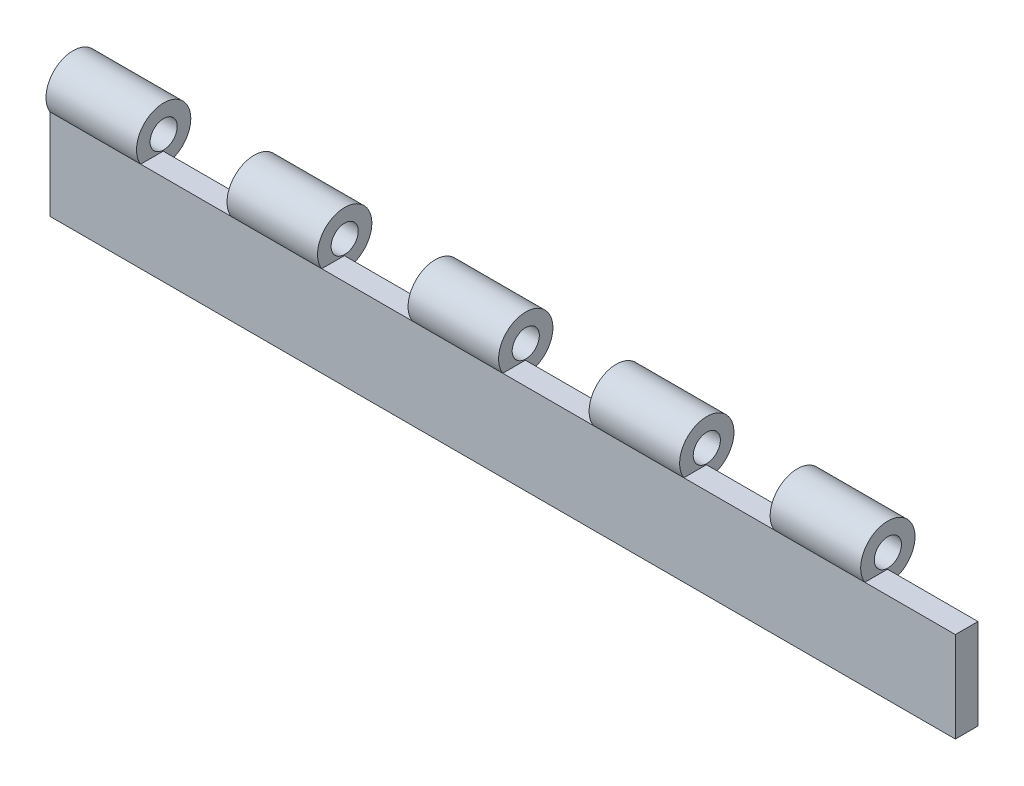
ISO-10303-21;
HEADER;
FILE_DESCRIPTION(('STEP AP214'),'2;1');
FILE_NAME('part.step','',(''),(''),'','','');
FILE_SCHEMA(('AUTOMOTIVE_DESIGN { 1 0 10303 214 1 1 1 1 }'));
ENDSEC;
DATA;
#1=APPLICATION_CONTEXT('core data for automotive mechanical design processes');
#2=APPLICATION_PROTOCOL_DEFINITION('international standard','automotive_design',2000,#1);
#3=PRODUCT_CONTEXT('',#1,'mechanical');
#4=PRODUCT('Part','Part','',(#3));
#5=PRODUCT_RELATED_PRODUCT_CATEGORY('part','',(#4));
#6=PRODUCT_DEFINITION_FORMATION('','',#4);
#7=PRODUCT_DEFINITION_CONTEXT('part definition',#1,'design');
#8=PRODUCT_DEFINITION('design','',#6,#7);
#9=PRODUCT_DEFINITION_SHAPE('','',#8);
#10=(LENGTH_UNIT() NAMED_UNIT(*) SI_UNIT(.MILLI.,.METRE.));
#11=(NAMED_UNIT(*) PLANE_ANGLE_UNIT() SI_UNIT($,.RADIAN.));
#12=(NAMED_UNIT(*) SI_UNIT($,.STERADIAN.) SOLID_ANGLE_UNIT());
#13=UNCERTAINTY_MEASURE_WITH_UNIT(LENGTH_MEASURE(1.E-05),#10,'distance_accuracy_value','');
#14=(GEOMETRIC_REPRESENTATION_CONTEXT(3) GLOBAL_UNCERTAINTY_ASSIGNED_CONTEXT((#13)) GLOBAL_UNIT_ASSIGNED_CONTEXT((#10,
#11,#12)) REPRESENTATION_CONTEXT('',''));
#15=CARTESIAN_POINT('',(0.,0.,0.));
#16=DIRECTION('',(0.,0.,1.));
#17=DIRECTION('',(1.,0.,0.));
#18=AXIS2_PLACEMENT_3D('',#15,#16,#17);
#19=CARTESIAN_POINT('',(12.3537042946623,24.6065364594952,2.75891847525368));
#20=DIRECTION('',(0.,-1.,0.));
#21=DIRECTION('',(0.,0.,-1.));
#22=AXIS2_PLACEMENT_3D('',#19,#20,#21);
#23=PLANE('',#22);
#24=DIRECTION('',(0.,0.,-1.));
#25=VECTOR('',#24,1.);
#26=CARTESIAN_POINT('',(218.093704294662,24.6065364594952,2.75891847525368));
#27=LINE('',#26,#25);
#28=CARTESIAN_POINT('',(218.093704294662,24.6065364594952,2.75891847525368));
#29=VERTEX_POINT('',#28);
#30=CARTESIAN_POINT('',(218.093704294662,24.6065364594952,-2.95608152474632));
#31=VERTEX_POINT('',#30);
#32=EDGE_CURVE('E165',#29,#31,#27,.T.);
#33=ORIENTED_EDGE('',*,*,#32,.F.);
#34=DIRECTION('',(-1.,0.,0.));
#35=VECTOR('',#34,1.);
#36=CARTESIAN_POINT('',(12.3537042946623,24.6065364594952,2.75891847525368));
#37=LINE('',#36,#35);
#38=CARTESIAN_POINT('',(240.953704294662,24.6065364594952,2.75891847525368));
#39=VERTEX_POINT('',#38);
#40=EDGE_CURVE('E280',#39,#29,#37,.T.);
#41=ORIENTED_EDGE('',*,*,#40,.F.);
#42=DIRECTION('',(0.,0.,-1.));
#43=VECTOR('',#42,1.);
#44=CARTESIAN_POINT('',(240.953704294662,24.6065364594952,2.75891847525368));
#45=LINE('',#44,#43);
#46=CARTESIAN_POINT('',(240.953704294662,24.6065364594952,-2.95608152474632));
#47=VERTEX_POINT('',#46);
#48=EDGE_CURVE('E283',#39,#47,#45,.T.);
#49=ORIENTED_EDGE('',*,*,#48,.T.);
#50=DIRECTION('',(-1.,0.,0.));
#51=VECTOR('',#50,1.);
#52=CARTESIAN_POINT('',(12.3537042946623,24.6065364594952,-2.95608152474632));
#53=LINE('',#52,#51);
#54=EDGE_CURVE('E275',#47,#31,#53,.T.);
#55=ORIENTED_EDGE('',*,*,#54,.T.);
#56=EDGE_LOOP('',(#33,#41,#49,#55));
#57=FACE_BOUND('',#56,.T.);
#58=ADVANCED_FACE('F35',(#57),#23,.F.);
#59=CARTESIAN_POINT('',(12.3537042946622,1.74653645949524,-2.95608152474632));
#60=DIRECTION('',(0.,0.,-1.));
#61=DIRECTION('',(-1.,0.,0.));
#62=AXIS2_PLACEMENT_3D('',#59,#60,#61);
#63=PLANE('',#62);
#64=DIRECTION('',(-1.,0.,0.));
#65=VECTOR('',#64,1.);
#66=CARTESIAN_POINT('',(218.093704294662,21.3974184715143,-2.95608152474632));
#67=LINE('',#66,#65);
#68=CARTESIAN_POINT('',(218.093704294662,21.3974184715143,-2.95608152474632));
#69=VERTEX_POINT('',#68);
#70=CARTESIAN_POINT('',(195.233704294662,21.3974184715143,-2.95608152474632));
#71=VERTEX_POINT('',#70);
#72=EDGE_CURVE('E157',#69,#71,#67,.T.);
#73=ORIENTED_EDGE('',*,*,#72,.F.);
#74=DIRECTION('',(0.,1.,0.));
#75=VECTOR('',#74,1.);
#76=CARTESIAN_POINT('',(218.093704294662,1.74653645949533,-2.95608152474632));
#77=LINE('',#76,#75);
#78=EDGE_CURVE('E180',#69,#31,#77,.T.);
#79=ORIENTED_EDGE('',*,*,#78,.T.);
#80=ORIENTED_EDGE('',*,*,#54,.F.);
#81=DIRECTION('',(0.,1.,0.));
#82=VECTOR('',#81,1.);
#83=CARTESIAN_POINT('',(240.953704294662,1.74653645949524,-2.95608152474632));
#84=LINE('',#83,#82);
#85=CARTESIAN_POINT('',(240.953704294662,1.74653645949524,-2.95608152474632));
#86=VERTEX_POINT('',#85);
#87=EDGE_CURVE('E289',#86,#47,#84,.T.);
#88=ORIENTED_EDGE('',*,*,#87,.F.);
#89=DIRECTION('',(1.,0.,0.));
#90=VECTOR('',#89,1.);
#91=CARTESIAN_POINT('',(12.3537042946622,1.74653645949524,-2.95608152474632));
#92=LINE('',#91,#90);
#93=CARTESIAN_POINT('',(12.3537042946622,1.74653645949524,-2.95608152474632));
#94=VERTEX_POINT('',#93);
#95=EDGE_CURVE('E287',#94,#86,#92,.T.);
#96=ORIENTED_EDGE('',*,*,#95,.F.);
#97=DIRECTION('',(0.,-1.,0.));
#98=VECTOR('',#97,1.);
#99=CARTESIAN_POINT('',(12.3537042946622,1.74653645949524,-2.95608152474632));
#100=LINE('',#99,#98);
#101=CARTESIAN_POINT('',(12.3537042946622,21.3974184715143,-2.95608152474632));
#102=VERTEX_POINT('',#101);
#103=EDGE_CURVE('E270',#102,#94,#100,.T.);
#104=ORIENTED_EDGE('',*,*,#103,.F.);
#105=DIRECTION('',(-1.,0.,0.));
#106=VECTOR('',#105,1.);
#107=CARTESIAN_POINT('',(35.2137042946623,21.3974184715143,-2.95608152474632));
#108=LINE('',#107,#106);
#109=CARTESIAN_POINT('',(35.2137042946623,21.3974184715143,-2.95608152474632));
#110=VERTEX_POINT('',#109);
#111=EDGE_CURVE('E305',#110,#102,#108,.T.);
#112=ORIENTED_EDGE('',*,*,#111,.F.);
#113=DIRECTION('',(0.,1.,0.));
#114=VECTOR('',#113,1.);
#115=CARTESIAN_POINT('',(35.2137042946623,1.74653645949525,-2.95608152474632));
#116=LINE('',#115,#114);
#117=CARTESIAN_POINT('',(35.2137042946623,24.6065364594952,-2.95608152474632));
#118=VERTEX_POINT('',#117);
#119=EDGE_CURVE('E302',#110,#118,#116,.T.);
#120=ORIENTED_EDGE('',*,*,#119,.T.);
#121=CARTESIAN_POINT('',(58.0737042946622,24.6065364594952,-2.95608152474632));
#122=VERTEX_POINT('',#121);
#123=EDGE_CURVE('E291',#122,#118,#53,.T.);
#124=ORIENTED_EDGE('',*,*,#123,.F.);
#125=DIRECTION('',(0.,1.,0.));
#126=VECTOR('',#125,1.);
#127=CARTESIAN_POINT('',(58.0737042946622,1.74653645949526,-2.95608152474632));
#128=LINE('',#127,#126);
#129=CARTESIAN_POINT('',(58.0737042946622,21.3974184715143,-2.95608152474632));
#130=VERTEX_POINT('',#129);
#131=EDGE_CURVE('E308',#130,#122,#128,.T.);
#132=ORIENTED_EDGE('',*,*,#131,.F.);
#133=DIRECTION('',(-1.,0.,0.));
#134=VECTOR('',#133,1.);
#135=CARTESIAN_POINT('',(80.9337042946622,21.3974184715143,-2.95608152474632));
#136=LINE('',#135,#134);
#137=CARTESIAN_POINT('',(80.9337042946622,21.3974184715143,-2.95608152474632));
#138=VERTEX_POINT('',#137);
#139=EDGE_CURVE('E43',#138,#130,#136,.T.);
#140=ORIENTED_EDGE('',*,*,#139,.F.);
#141=DIRECTION('',(0.,1.,0.));
#142=VECTOR('',#141,1.);
#143=CARTESIAN_POINT('',(80.9337042946623,1.74653645949527,-2.95608152474632));
#144=LINE('',#143,#142);
#145=CARTESIAN_POINT('',(80.9337042946622,24.6065364594952,-2.95608152474632));
#146=VERTEX_POINT('',#145);
#147=EDGE_CURVE('E11',#138,#146,#144,.T.);
#148=ORIENTED_EDGE('',*,*,#147,.T.);
#149=CARTESIAN_POINT('',(103.793704294662,24.6065364594952,-2.95608152474632));
#150=VERTEX_POINT('',#149);
#151=EDGE_CURVE('E335',#150,#146,#53,.T.);
#152=ORIENTED_EDGE('',*,*,#151,.F.);
#153=DIRECTION('',(0.,1.,0.));
#154=VECTOR('',#153,1.);
#155=CARTESIAN_POINT('',(103.793704294662,1.74653645949528,-2.95608152474632));
#156=LINE('',#155,#154);
#157=CARTESIAN_POINT('',(103.793704294662,21.3974184715143,-2.95608152474632));
#158=VERTEX_POINT('',#157);
#159=EDGE_CURVE('E217',#158,#150,#156,.T.);
#160=ORIENTED_EDGE('',*,*,#159,.F.);
#161=DIRECTION('',(-1.,0.,0.));
#162=VECTOR('',#161,1.);
#163=CARTESIAN_POINT('',(126.653704294662,21.3974184715143,-2.95608152474632));
#164=LINE('',#163,#162);
#165=CARTESIAN_POINT('',(126.653704294662,21.3974184715143,-2.95608152474632));
#166=VERTEX_POINT('',#165);
#167=EDGE_CURVE('E230',#166,#158,#164,.T.);
#168=ORIENTED_EDGE('',*,*,#167,.F.);
#169=DIRECTION('',(0.,1.,0.));
#170=VECTOR('',#169,1.);
#171=CARTESIAN_POINT('',(126.653704294662,1.74653645949529,-2.95608152474632));
#172=LINE('',#171,#170);
#173=CARTESIAN_POINT('',(126.653704294662,24.6065364594952,-2.95608152474632));
#174=VERTEX_POINT('',#173);
#175=EDGE_CURVE('E224',#166,#174,#172,.T.);
#176=ORIENTED_EDGE('',*,*,#175,.T.);
#177=CARTESIAN_POINT('',(149.513704294662,24.6065364594952,-2.95608152474632));
#178=VERTEX_POINT('',#177);
#179=EDGE_CURVE('E338',#178,#174,#53,.T.);
#180=ORIENTED_EDGE('',*,*,#179,.F.);
#181=DIRECTION('',(0.,1.,0.));
#182=VECTOR('',#181,1.);
#183=CARTESIAN_POINT('',(149.513704294662,1.7465364594953,-2.95608152474632));
#184=LINE('',#183,#182);
#185=CARTESIAN_POINT('',(149.513704294662,21.3974184715143,-2.95608152474632));
#186=VERTEX_POINT('',#185);
#187=EDGE_CURVE('E194',#186,#178,#184,.T.);
#188=ORIENTED_EDGE('',*,*,#187,.F.);
#189=DIRECTION('',(-1.,0.,0.));
#190=VECTOR('',#189,1.);
#191=CARTESIAN_POINT('',(172.373704294662,21.3974184715143,-2.95608152474632));
#192=LINE('',#191,#190);
#193=CARTESIAN_POINT('',(172.373704294662,21.3974184715143,-2.95608152474632));
#194=VERTEX_POINT('',#193);
#195=EDGE_CURVE('E205',#194,#186,#192,.T.);
#196=ORIENTED_EDGE('',*,*,#195,.F.);
#197=DIRECTION('',(0.,1.,0.));
#198=VECTOR('',#197,1.);
#199=CARTESIAN_POINT('',(172.373704294662,1.74653645949531,-2.95608152474632));
#200=LINE('',#199,#198);
#201=CARTESIAN_POINT('',(172.373704294662,24.6065364594952,-2.95608152474632));
#202=VERTEX_POINT('',#201);
#203=EDGE_CURVE('E200',#194,#202,#200,.T.);
#204=ORIENTED_EDGE('',*,*,#203,.T.);
#205=CARTESIAN_POINT('',(195.233704294662,24.6065364594952,-2.95608152474632));
#206=VERTEX_POINT('',#205);
#207=EDGE_CURVE('E178',#206,#202,#53,.T.);
#208=ORIENTED_EDGE('',*,*,#207,.F.);
#209=DIRECTION('',(0.,1.,0.));
#210=VECTOR('',#209,1.);
#211=CARTESIAN_POINT('',(195.233704294662,1.74653645949532,-2.95608152474632));
#212=LINE('',#211,#210);
#213=EDGE_CURVE('E169',#71,#206,#212,.T.);
#214=ORIENTED_EDGE('',*,*,#213,.F.);
#215=EDGE_LOOP('',(#73,#79,#80,#88,#96,#104,#112,#120,#124,#132,#140,#148,#152,#160,#168,#176,
#180,#188,#196,#204,#208,#214));
#216=FACE_BOUND('',#215,.T.);
#217=ADVANCED_FACE('F176',(#216),#63,.T.);
#218=CARTESIAN_POINT('',(195.233704294662,24.6065364594952,2.75891847525368));
#219=VERTEX_POINT('',#218);
#220=CARTESIAN_POINT('',(172.373704294662,24.6065364594952,2.75891847525368));
#221=VERTEX_POINT('',#220);
#222=EDGE_CURVE('E285',#219,#221,#37,.T.);
#223=ORIENTED_EDGE('',*,*,#222,.F.);
#224=DIRECTION('',(0.,0.,-1.));
#225=VECTOR('',#224,1.);
#226=CARTESIAN_POINT('',(195.233704294662,24.6065364594952,2.75891847525368));
#227=LINE('',#226,#225);
#228=EDGE_CURVE('E171',#219,#206,#227,.T.);
#229=ORIENTED_EDGE('',*,*,#228,.T.);
#230=ORIENTED_EDGE('',*,*,#207,.T.);
#231=DIRECTION('',(0.,0.,-1.));
#232=VECTOR('',#231,1.);
#233=CARTESIAN_POINT('',(172.373704294662,24.6065364594952,2.75891847525368));
#234=LINE('',#233,#232);
#235=EDGE_CURVE('E202',#221,#202,#234,.T.);
#236=ORIENTED_EDGE('',*,*,#235,.F.);
#237=EDGE_LOOP('',(#223,#229,#230,#236));
#238=FACE_BOUND('',#237,.T.);
#239=ADVANCED_FACE('F344',(#238),#23,.F.);
#240=CARTESIAN_POINT('',(149.513704294662,24.6065364594952,2.75891847525368));
#241=VERTEX_POINT('',#240);
#242=CARTESIAN_POINT('',(126.653704294662,24.6065364594952,2.75891847525368));
#243=VERTEX_POINT('',#242);
#244=EDGE_CURVE('E354',#241,#243,#37,.T.);
#245=ORIENTED_EDGE('',*,*,#244,.F.);
#246=DIRECTION('',(0.,0.,-1.));
#247=VECTOR('',#246,1.);
#248=CARTESIAN_POINT('',(149.513704294662,24.6065364594952,2.75891847525368));
#249=LINE('',#248,#247);
#250=EDGE_CURVE('E197',#241,#178,#249,.T.);
#251=ORIENTED_EDGE('',*,*,#250,.T.);
#252=ORIENTED_EDGE('',*,*,#179,.T.);
#253=DIRECTION('',(0.,0.,-1.));
#254=VECTOR('',#253,1.);
#255=CARTESIAN_POINT('',(126.653704294662,24.6065364594952,2.75891847525368));
#256=LINE('',#255,#254);
#257=EDGE_CURVE('E227',#243,#174,#256,.T.);
#258=ORIENTED_EDGE('',*,*,#257,.F.);
#259=EDGE_LOOP('',(#245,#251,#252,#258));
#260=FACE_BOUND('',#259,.T.);
#261=ADVANCED_FACE('F356',(#260),#23,.F.);
#262=CARTESIAN_POINT('',(103.793704294662,24.6065364594952,2.75891847525368));
#263=VERTEX_POINT('',#262);
#264=CARTESIAN_POINT('',(80.9337042946622,24.6065364594952,2.75891847525368));
#265=VERTEX_POINT('',#264);
#266=EDGE_CURVE('E325',#263,#265,#37,.T.);
#267=ORIENTED_EDGE('',*,*,#266,.F.);
#268=DIRECTION('',(0.,0.,-1.));
#269=VECTOR('',#268,1.);
#270=CARTESIAN_POINT('',(103.793704294662,24.6065364594952,2.75891847525368));
#271=LINE('',#270,#269);
#272=EDGE_CURVE('E221',#263,#150,#271,.T.);
#273=ORIENTED_EDGE('',*,*,#272,.T.);
#274=ORIENTED_EDGE('',*,*,#151,.T.);
#275=DIRECTION('',(0.,0.,-1.));
#276=VECTOR('',#275,1.);
#277=CARTESIAN_POINT('',(80.9337042946622,24.6065364594952,2.75891847525368));
#278=LINE('',#277,#276);
#279=EDGE_CURVE('E247',#265,#146,#278,.T.);
#280=ORIENTED_EDGE('',*,*,#279,.F.);
#281=EDGE_LOOP('',(#267,#273,#274,#280));
#282=FACE_BOUND('',#281,.T.);
#283=ADVANCED_FACE('F368',(#282),#23,.F.);
#284=CARTESIAN_POINT('',(58.0737042946622,24.6065364594952,2.75891847525368));
#285=VERTEX_POINT('',#284);
#286=CARTESIAN_POINT('',(35.2137042946623,24.6065364594951,2.75891847525368));
#287=VERTEX_POINT('',#286);
#288=EDGE_CURVE('E279',#285,#287,#37,.T.);
#289=ORIENTED_EDGE('',*,*,#288,.F.);
#290=DIRECTION('',(0.,0.,-1.));
#291=VECTOR('',#290,1.);
#292=CARTESIAN_POINT('',(58.0737042946622,24.6065364594952,2.75891847525368));
#293=LINE('',#292,#291);
#294=EDGE_CURVE('E242',#285,#122,#293,.T.);
#295=ORIENTED_EDGE('',*,*,#294,.T.);
#296=ORIENTED_EDGE('',*,*,#123,.T.);
#297=DIRECTION('',(0.,0.,-1.));
#298=VECTOR('',#297,1.);
#299=CARTESIAN_POINT('',(35.2137042946623,24.6065364594952,2.75891847525368));
#300=LINE('',#299,#298);
#301=EDGE_CURVE('E263',#287,#118,#300,.T.);
#302=ORIENTED_EDGE('',*,*,#301,.F.);
#303=EDGE_LOOP('',(#289,#295,#296,#302));
#304=FACE_BOUND('',#303,.T.);
#305=ADVANCED_FACE('F321',(#304),#23,.F.);
#306=CARTESIAN_POINT('',(12.3537042946622,1.74653645949524,2.75891847525368));
#307=DIRECTION('',(1.,0.,0.));
#308=DIRECTION('',(0.,1.,0.));
#309=AXIS2_PLACEMENT_3D('',#306,#307,#308);
#310=PLANE('',#309);
#311=DIRECTION('',(0.,-1.,0.));
#312=VECTOR('',#311,1.);
#313=CARTESIAN_POINT('',(12.3537042946622,1.74653645949524,2.75891847525368));
#314=LINE('',#313,#312);
#315=CARTESIAN_POINT('',(12.3537042946622,24.6065364594951,2.75891847525368));
#316=VERTEX_POINT('',#315);
#317=CARTESIAN_POINT('',(12.3537042946622,1.74653645949524,2.75891847525368));
#318=VERTEX_POINT('',#317);
#319=EDGE_CURVE('E271',#316,#318,#314,.T.);
#320=ORIENTED_EDGE('',*,*,#319,.F.);
#321=CARTESIAN_POINT('',(12.3537042946622,28.2548000974196,-3.048175154799));
#322=DIRECTION('',(-1.,0.,0.));
#323=DIRECTION('',(0.,-1.,0.));
#324=AXIS2_PLACEMENT_3D('',#321,#322,#323);
#325=CIRCLE('',#324,6.858);
#326=EDGE_CURVE('E257',#316,#102,#325,.T.);
#327=ORIENTED_EDGE('',*,*,#326,.T.);
#328=ORIENTED_EDGE('',*,*,#103,.T.);
#329=DIRECTION('',(0.,0.,-1.));
#330=VECTOR('',#329,1.);
#331=CARTESIAN_POINT('',(12.3537042946622,1.74653645949524,2.75891847525368));
#332=LINE('',#331,#330);
#333=EDGE_CURVE('E299',#318,#94,#332,.T.);
#334=ORIENTED_EDGE('',*,*,#333,.F.);
#335=EDGE_LOOP('',(#320,#327,#328,#334));
#336=FACE_BOUND('',#335,.T.);
#337=CARTESIAN_POINT('',(12.3537042946622,28.2548000974196,-3.048175154799));
#338=DIRECTION('',(-1.,0.,0.));
#339=DIRECTION('',(0.,-1.,0.));
#340=AXIS2_PLACEMENT_3D('',#337,#338,#339);
#341=CIRCLE('',#340,3.429);
#342=CARTESIAN_POINT('',(12.3537042946622,24.8258000974196,-3.048175154799));
#343=VERTEX_POINT('',#342);
#344=EDGE_CURVE('E253',#343,#343,#341,.T.);
#345=ORIENTED_EDGE('',*,*,#344,.F.);
#346=EDGE_LOOP('',(#345));
#347=FACE_BOUND('',#346,.T.);
#348=ADVANCED_FACE('F37',(#336,#347),#310,.F.);
#349=CARTESIAN_POINT('',(12.3537042946622,1.74653645949524,2.75891847525368));
#350=DIRECTION('',(0.,1.,0.));
#351=DIRECTION('',(0.,0.,1.));
#352=AXIS2_PLACEMENT_3D('',#349,#350,#351);
#353=PLANE('',#352);
#354=ORIENTED_EDGE('',*,*,#95,.T.);
#355=DIRECTION('',(0.,0.,-1.));
#356=VECTOR('',#355,1.);
#357=CARTESIAN_POINT('',(240.953704294662,1.74653645949524,2.75891847525368));
#358=LINE('',#357,#356);
#359=CARTESIAN_POINT('',(240.953704294662,1.74653645949524,2.75891847525368));
#360=VERTEX_POINT('',#359);
#361=EDGE_CURVE('E296',#360,#86,#358,.T.);
#362=ORIENTED_EDGE('',*,*,#361,.F.);
#363=DIRECTION('',(1.,0.,0.));
#364=VECTOR('',#363,1.);
#365=CARTESIAN_POINT('',(12.3537042946622,1.74653645949524,2.75891847525368));
#366=LINE('',#365,#364);
#367=EDGE_CURVE('E274',#318,#360,#366,.T.);
#368=ORIENTED_EDGE('',*,*,#367,.F.);
#369=ORIENTED_EDGE('',*,*,#333,.T.);
#370=EDGE_LOOP('',(#354,#362,#368,#369));
#371=FACE_BOUND('',#370,.T.);
#372=ADVANCED_FACE('F412',(#371),#353,.F.);
#373=CARTESIAN_POINT('',(240.953704294662,1.74653645949524,2.75891847525368));
#374=DIRECTION('',(-1.,0.,0.));
#375=DIRECTION('',(0.,-1.,0.));
#376=AXIS2_PLACEMENT_3D('',#373,#374,#375);
#377=PLANE('',#376);
#378=ORIENTED_EDGE('',*,*,#87,.T.);
#379=ORIENTED_EDGE('',*,*,#48,.F.);
#380=DIRECTION('',(0.,1.,0.));
#381=VECTOR('',#380,1.);
#382=CARTESIAN_POINT('',(240.953704294662,1.74653645949524,2.75891847525368));
#383=LINE('',#382,#381);
#384=EDGE_CURVE('E277',#360,#39,#383,.T.);
#385=ORIENTED_EDGE('',*,*,#384,.F.);
#386=ORIENTED_EDGE('',*,*,#361,.T.);
#387=EDGE_LOOP('',(#378,#379,#385,#386));
#388=FACE_BOUND('',#387,.T.);
#389=ADVANCED_FACE('F423',(#388),#377,.F.);
#390=CARTESIAN_POINT('',(12.3537042946622,1.74653645949524,2.75891847525368));
#391=DIRECTION('',(0.,0.,-1.));
#392=DIRECTION('',(-1.,0.,0.));
#393=AXIS2_PLACEMENT_3D('',#390,#391,#392);
#394=PLANE('',#393);
#395=ORIENTED_EDGE('',*,*,#319,.T.);
#396=ORIENTED_EDGE('',*,*,#367,.T.);
#397=ORIENTED_EDGE('',*,*,#384,.T.);
#398=ORIENTED_EDGE('',*,*,#40,.T.);
#399=EDGE_CURVE('E284',#29,#219,#37,.T.);
#400=ORIENTED_EDGE('',*,*,#399,.T.);
#401=ORIENTED_EDGE('',*,*,#222,.T.);
#402=EDGE_CURVE('E358',#221,#241,#37,.T.);
#403=ORIENTED_EDGE('',*,*,#402,.T.);
#404=ORIENTED_EDGE('',*,*,#244,.T.);
#405=EDGE_CURVE('E326',#243,#263,#37,.T.);
#406=ORIENTED_EDGE('',*,*,#405,.T.);
#407=ORIENTED_EDGE('',*,*,#266,.T.);
#408=DIRECTION('',(-1.,0.,0.));
#409=VECTOR('',#408,1.);
#410=CARTESIAN_POINT('',(80.9337042946622,24.6065364594952,2.75891847525368));
#411=LINE('',#410,#409);
#412=EDGE_CURVE('E250',#265,#285,#411,.T.);
#413=ORIENTED_EDGE('',*,*,#412,.T.);
#414=ORIENTED_EDGE('',*,*,#288,.T.);
#415=DIRECTION('',(-1.,0.,0.));
#416=VECTOR('',#415,1.);
#417=CARTESIAN_POINT('',(35.2137042946623,24.6065364594951,2.75891847525368));
#418=LINE('',#417,#416);
#419=EDGE_CURVE('E267',#287,#316,#418,.T.);
#420=ORIENTED_EDGE('',*,*,#419,.T.);
#421=EDGE_LOOP('',(#395,#396,#397,#398,#400,#401,#403,#404,#406,#407,#413,#414,#420));
#422=FACE_BOUND('',#421,.T.);
#423=ADVANCED_FACE('F327',(#422),#394,.F.);
#424=CARTESIAN_POINT('',(35.2137042946623,28.2548000974196,-3.048175154799));
#425=DIRECTION('',(-1.,0.,0.));
#426=DIRECTION('',(0.,-1.,0.));
#427=AXIS2_PLACEMENT_3D('',#424,#425,#426);
#428=CYLINDRICAL_SURFACE('',#427,6.858);
#429=ORIENTED_EDGE('',*,*,#419,.F.);
#430=CARTESIAN_POINT('',(35.2137042946623,28.2548000974196,-3.048175154799));
#431=DIRECTION('',(-1.,0.,0.));
#432=DIRECTION('',(0.,-1.,0.));
#433=AXIS2_PLACEMENT_3D('',#430,#431,#432);
#434=CIRCLE('',#433,6.858);
#435=EDGE_CURVE('E260',#287,#110,#434,.T.);
#436=ORIENTED_EDGE('',*,*,#435,.T.);
#437=ORIENTED_EDGE('',*,*,#111,.T.);
#438=ORIENTED_EDGE('',*,*,#326,.F.);
#439=EDGE_LOOP('',(#429,#436,#437,#438));
#440=FACE_BOUND('',#439,.T.);
#441=ADVANCED_FACE('F440',(#440),#428,.T.);
#442=CARTESIAN_POINT('',(35.2137042946623,28.2548000974196,-3.048175154799));
#443=DIRECTION('',(-1.,0.,0.));
#444=DIRECTION('',(0.,-1.,0.));
#445=AXIS2_PLACEMENT_3D('',#442,#443,#444);
#446=PLANE('',#445);
#447=CARTESIAN_POINT('',(35.2137042946623,28.2548000974196,-3.048175154799));
#448=DIRECTION('',(-1.,0.,0.));
#449=DIRECTION('',(0.,-1.,0.));
#450=AXIS2_PLACEMENT_3D('',#447,#448,#449);
#451=CIRCLE('',#450,3.429);
#452=CARTESIAN_POINT('',(35.2137042946623,24.8258000974196,-3.048175154799));
#453=VERTEX_POINT('',#452);
#454=EDGE_CURVE('E254',#453,#453,#451,.T.);
#455=ORIENTED_EDGE('',*,*,#454,.T.);
#456=EDGE_LOOP('',(#455));
#457=FACE_BOUND('',#456,.T.);
#458=ORIENTED_EDGE('',*,*,#435,.F.);
#459=ORIENTED_EDGE('',*,*,#301,.T.);
#460=ORIENTED_EDGE('',*,*,#119,.F.);
#461=EDGE_LOOP('',(#458,#459,#460));
#462=FACE_BOUND('',#461,.T.);
#463=ADVANCED_FACE('F449',(#457,#462),#446,.F.);
#464=CARTESIAN_POINT('',(35.2137042946623,28.2548000974196,-3.048175154799));
#465=DIRECTION('',(-1.,0.,0.));
#466=DIRECTION('',(0.,-1.,0.));
#467=AXIS2_PLACEMENT_3D('',#464,#465,#466);
#468=CYLINDRICAL_SURFACE('',#467,3.429);
#469=ORIENTED_EDGE('',*,*,#454,.F.);
#470=EDGE_LOOP('',(#469));
#471=FACE_BOUND('',#470,.T.);
#472=ORIENTED_EDGE('',*,*,#344,.T.);
#473=EDGE_LOOP('',(#472));
#474=FACE_BOUND('',#473,.T.);
#475=ADVANCED_FACE('F459',(#471,#474),#468,.F.);
#476=CARTESIAN_POINT('',(80.9337042946622,28.2548000974196,-3.048175154799));
#477=DIRECTION('',(-1.,0.,0.));
#478=DIRECTION('',(0.,-1.,0.));
#479=AXIS2_PLACEMENT_3D('',#476,#477,#478);
#480=CYLINDRICAL_SURFACE('',#479,6.858);
#481=ORIENTED_EDGE('',*,*,#412,.F.);
#482=CARTESIAN_POINT('',(80.9337042946622,28.2548000974196,-3.048175154799));
#483=DIRECTION('',(-1.,0.,0.));
#484=DIRECTION('',(0.,-1.,0.));
#485=AXIS2_PLACEMENT_3D('',#482,#483,#484);
#486=CIRCLE('',#485,6.858);
#487=EDGE_CURVE('E239',#265,#138,#486,.T.);
#488=ORIENTED_EDGE('',*,*,#487,.T.);
#489=ORIENTED_EDGE('',*,*,#139,.T.);
#490=CARTESIAN_POINT('',(58.0737042946622,28.2548000974196,-3.048175154799));
#491=DIRECTION('',(-1.,0.,0.));
#492=DIRECTION('',(0.,-1.,0.));
#493=AXIS2_PLACEMENT_3D('',#490,#491,#492);
#494=CIRCLE('',#493,6.858);
#495=EDGE_CURVE('E236',#285,#130,#494,.T.);
#496=ORIENTED_EDGE('',*,*,#495,.F.);
#497=EDGE_LOOP('',(#481,#488,#489,#496));
#498=FACE_BOUND('',#497,.T.);
#499=ADVANCED_FACE('F314',(#498),#480,.T.);
#500=CARTESIAN_POINT('',(80.9337042946622,28.2548000974196,-3.048175154799));
#501=DIRECTION('',(-1.,0.,0.));
#502=DIRECTION('',(0.,-1.,0.));
#503=AXIS2_PLACEMENT_3D('',#500,#501,#502);
#504=PLANE('',#503);
#505=CARTESIAN_POINT('',(80.9337042946622,28.2548000974196,-3.048175154799));
#506=DIRECTION('',(-1.,0.,0.));
#507=DIRECTION('',(0.,-1.,0.));
#508=AXIS2_PLACEMENT_3D('',#505,#506,#507);
#509=CIRCLE('',#508,3.429);
#510=CARTESIAN_POINT('',(80.9337042946622,24.8258000974196,-3.048175154799));
#511=VERTEX_POINT('',#510);
#512=EDGE_CURVE('E233',#511,#511,#509,.T.);
#513=ORIENTED_EDGE('',*,*,#512,.T.);
#514=EDGE_LOOP('',(#513));
#515=FACE_BOUND('',#514,.T.);
#516=ORIENTED_EDGE('',*,*,#487,.F.);
#517=ORIENTED_EDGE('',*,*,#279,.T.);
#518=ORIENTED_EDGE('',*,*,#147,.F.);
#519=EDGE_LOOP('',(#516,#517,#518));
#520=FACE_BOUND('',#519,.T.);
#521=ADVANCED_FACE('F332',(#515,#520),#504,.F.);
#522=CARTESIAN_POINT('',(58.0737042946622,28.2548000974196,-3.048175154799));
#523=DIRECTION('',(-1.,0.,0.));
#524=DIRECTION('',(0.,-1.,0.));
#525=AXIS2_PLACEMENT_3D('',#522,#523,#524);
#526=PLANE('',#525);
#527=CARTESIAN_POINT('',(58.0737042946622,28.2548000974196,-3.048175154799));
#528=DIRECTION('',(-1.,0.,0.));
#529=DIRECTION('',(0.,-1.,0.));
#530=AXIS2_PLACEMENT_3D('',#527,#528,#529);
#531=CIRCLE('',#530,3.429);
#532=CARTESIAN_POINT('',(58.0737042946622,24.8258000974196,-3.048175154799));
#533=VERTEX_POINT('',#532);
#534=EDGE_CURVE('E232',#533,#533,#531,.T.);
#535=ORIENTED_EDGE('',*,*,#534,.F.);
#536=EDGE_LOOP('',(#535));
#537=FACE_BOUND('',#536,.T.);
#538=ORIENTED_EDGE('',*,*,#294,.F.);
#539=ORIENTED_EDGE('',*,*,#495,.T.);
#540=ORIENTED_EDGE('',*,*,#131,.T.);
#541=EDGE_LOOP('',(#538,#539,#540));
#542=FACE_BOUND('',#541,.T.);
#543=ADVANCED_FACE('F319',(#537,#542),#526,.T.);
#544=CARTESIAN_POINT('',(80.9337042946622,28.2548000974196,-3.048175154799));
#545=DIRECTION('',(-1.,0.,0.));
#546=DIRECTION('',(0.,-1.,0.));
#547=AXIS2_PLACEMENT_3D('',#544,#545,#546);
#548=CYLINDRICAL_SURFACE('',#547,3.429);
#549=ORIENTED_EDGE('',*,*,#512,.F.);
#550=EDGE_LOOP('',(#549));
#551=FACE_BOUND('',#550,.T.);
#552=ORIENTED_EDGE('',*,*,#534,.T.);
#553=EDGE_LOOP('',(#552));
#554=FACE_BOUND('',#553,.T.);
#555=ADVANCED_FACE('F497',(#551,#554),#548,.F.);
#556=CARTESIAN_POINT('',(126.653704294662,28.2548000974196,-3.048175154799));
#557=DIRECTION('',(-1.,0.,0.));
#558=DIRECTION('',(0.,-1.,0.));
#559=AXIS2_PLACEMENT_3D('',#556,#557,#558);
#560=PLANE('',#559);
#561=CARTESIAN_POINT('',(126.653704294662,28.2548000974196,-3.048175154799));
#562=DIRECTION('',(-1.,0.,0.));
#563=DIRECTION('',(0.,-1.,0.));
#564=AXIS2_PLACEMENT_3D('',#561,#562,#563);
#565=CIRCLE('',#564,3.429);
#566=CARTESIAN_POINT('',(126.653704294662,24.8258000974196,-3.048175154799));
#567=VERTEX_POINT('',#566);
#568=EDGE_CURVE('E208',#567,#567,#565,.T.);
#569=ORIENTED_EDGE('',*,*,#568,.T.);
#570=EDGE_LOOP('',(#569));
#571=FACE_BOUND('',#570,.T.);
#572=CARTESIAN_POINT('',(126.653704294662,28.2548000974196,-3.048175154799));
#573=DIRECTION('',(-1.,0.,0.));
#574=DIRECTION('',(0.,-1.,0.));
#575=AXIS2_PLACEMENT_3D('',#572,#573,#574);
#576=CIRCLE('',#575,6.858);
#577=EDGE_CURVE('E214',#243,#166,#576,.T.);
#578=ORIENTED_EDGE('',*,*,#577,.F.);
#579=ORIENTED_EDGE('',*,*,#257,.T.);
#580=ORIENTED_EDGE('',*,*,#175,.F.);
#581=EDGE_LOOP('',(#578,#579,#580));
#582=FACE_BOUND('',#581,.T.);
#583=ADVANCED_FACE('F365',(#571,#582),#560,.F.);
#584=CARTESIAN_POINT('',(103.793704294662,28.2548000974196,-3.048175154799));
#585=DIRECTION('',(-1.,0.,0.));
#586=DIRECTION('',(0.,-1.,0.));
#587=AXIS2_PLACEMENT_3D('',#584,#585,#586);
#588=PLANE('',#587);
#589=CARTESIAN_POINT('',(103.793704294662,28.2548000974196,-3.048175154799));
#590=DIRECTION('',(-1.,0.,0.));
#591=DIRECTION('',(0.,-1.,0.));
#592=AXIS2_PLACEMENT_3D('',#589,#590,#591);
#593=CIRCLE('',#592,3.429);
#594=CARTESIAN_POINT('',(103.793704294662,24.8258000974196,-3.048175154799));
#595=VERTEX_POINT('',#594);
#596=EDGE_CURVE('E207',#595,#595,#593,.T.);
#597=ORIENTED_EDGE('',*,*,#596,.F.);
#598=EDGE_LOOP('',(#597));
#599=FACE_BOUND('',#598,.T.);
#600=ORIENTED_EDGE('',*,*,#272,.F.);
#601=CARTESIAN_POINT('',(103.793704294662,28.2548000974196,-3.048175154799));
#602=DIRECTION('',(-1.,0.,0.));
#603=DIRECTION('',(0.,-1.,0.));
#604=AXIS2_PLACEMENT_3D('',#601,#602,#603);
#605=CIRCLE('',#604,6.858);
#606=EDGE_CURVE('E211',#263,#158,#605,.T.);
#607=ORIENTED_EDGE('',*,*,#606,.T.);
#608=ORIENTED_EDGE('',*,*,#159,.T.);
#609=EDGE_LOOP('',(#600,#607,#608));
#610=FACE_BOUND('',#609,.T.);
#611=ADVANCED_FACE('F367',(#599,#610),#588,.T.);
#612=CARTESIAN_POINT('',(126.653704294662,28.2548000974196,-3.048175154799));
#613=DIRECTION('',(-1.,0.,0.));
#614=DIRECTION('',(0.,-1.,0.));
#615=AXIS2_PLACEMENT_3D('',#612,#613,#614);
#616=CYLINDRICAL_SURFACE('',#615,6.858);
#617=ORIENTED_EDGE('',*,*,#577,.T.);
#618=ORIENTED_EDGE('',*,*,#167,.T.);
#619=ORIENTED_EDGE('',*,*,#606,.F.);
#620=ORIENTED_EDGE('',*,*,#405,.F.);
#621=EDGE_LOOP('',(#617,#618,#619,#620));
#622=FACE_BOUND('',#621,.T.);
#623=ADVANCED_FACE('F362',(#622),#616,.T.);
#624=CARTESIAN_POINT('',(126.653704294662,28.2548000974196,-3.048175154799));
#625=DIRECTION('',(-1.,0.,0.));
#626=DIRECTION('',(0.,-1.,0.));
#627=AXIS2_PLACEMENT_3D('',#624,#625,#626);
#628=CYLINDRICAL_SURFACE('',#627,3.429);
#629=ORIENTED_EDGE('',*,*,#568,.F.);
#630=EDGE_LOOP('',(#629));
#631=FACE_BOUND('',#630,.T.);
#632=ORIENTED_EDGE('',*,*,#596,.T.);
#633=EDGE_LOOP('',(#632));
#634=FACE_BOUND('',#633,.T.);
#635=ADVANCED_FACE('F534',(#631,#634),#628,.F.);
#636=CARTESIAN_POINT('',(172.373704294662,28.2548000974196,-3.048175154799));
#637=DIRECTION('',(-1.,0.,0.));
#638=DIRECTION('',(0.,-1.,0.));
#639=AXIS2_PLACEMENT_3D('',#636,#637,#638);
#640=PLANE('',#639);
#641=CARTESIAN_POINT('',(172.373704294662,28.2548000974196,-3.048175154799));
#642=DIRECTION('',(-1.,0.,0.));
#643=DIRECTION('',(0.,-1.,0.));
#644=AXIS2_PLACEMENT_3D('',#641,#642,#643);
#645=CIRCLE('',#644,3.429);
#646=CARTESIAN_POINT('',(172.373704294662,24.8258000974196,-3.048175154799));
#647=VERTEX_POINT('',#646);
#648=EDGE_CURVE('E186',#647,#647,#645,.T.);
#649=ORIENTED_EDGE('',*,*,#648,.T.);
#650=EDGE_LOOP('',(#649));
#651=FACE_BOUND('',#650,.T.);
#652=CARTESIAN_POINT('',(172.373704294662,28.2548000974196,-3.048175154799));
#653=DIRECTION('',(-1.,0.,0.));
#654=DIRECTION('',(0.,-1.,0.));
#655=AXIS2_PLACEMENT_3D('',#652,#653,#654);
#656=CIRCLE('',#655,6.858);
#657=EDGE_CURVE('E191',#221,#194,#656,.T.);
#658=ORIENTED_EDGE('',*,*,#657,.F.);
#659=ORIENTED_EDGE('',*,*,#235,.T.);
#660=ORIENTED_EDGE('',*,*,#203,.F.);
#661=EDGE_LOOP('',(#658,#659,#660));
#662=FACE_BOUND('',#661,.T.);
#663=ADVANCED_FACE('F347',(#651,#662),#640,.F.);
#664=CARTESIAN_POINT('',(149.513704294662,28.2548000974196,-3.048175154799));
#665=DIRECTION('',(-1.,0.,0.));
#666=DIRECTION('',(0.,-1.,0.));
#667=AXIS2_PLACEMENT_3D('',#664,#665,#666);
#668=PLANE('',#667);
#669=CARTESIAN_POINT('',(149.513704294662,28.2548000974196,-3.048175154799));
#670=DIRECTION('',(-1.,0.,0.));
#671=DIRECTION('',(0.,-1.,0.));
#672=AXIS2_PLACEMENT_3D('',#669,#670,#671);
#673=CIRCLE('',#672,3.429);
#674=CARTESIAN_POINT('',(149.513704294662,24.8258000974196,-3.048175154799));
#675=VERTEX_POINT('',#674);
#676=EDGE_CURVE('E164',#675,#675,#673,.T.);
#677=ORIENTED_EDGE('',*,*,#676,.F.);
#678=EDGE_LOOP('',(#677));
#679=FACE_BOUND('',#678,.T.);
#680=ORIENTED_EDGE('',*,*,#250,.F.);
#681=CARTESIAN_POINT('',(149.513704294662,28.2548000974196,-3.048175154799));
#682=DIRECTION('',(-1.,0.,0.));
#683=DIRECTION('',(0.,-1.,0.));
#684=AXIS2_PLACEMENT_3D('',#681,#682,#683);
#685=CIRCLE('',#684,6.858);
#686=EDGE_CURVE('E58',#241,#186,#685,.T.);
#687=ORIENTED_EDGE('',*,*,#686,.T.);
#688=ORIENTED_EDGE('',*,*,#187,.T.);
#689=EDGE_LOOP('',(#680,#687,#688));
#690=FACE_BOUND('',#689,.T.);
#691=ADVANCED_FACE('F352',(#679,#690),#668,.T.);
#692=CARTESIAN_POINT('',(172.373704294662,28.2548000974196,-3.048175154799));
#693=DIRECTION('',(-1.,0.,0.));
#694=DIRECTION('',(0.,-1.,0.));
#695=AXIS2_PLACEMENT_3D('',#692,#693,#694);
#696=CYLINDRICAL_SURFACE('',#695,6.858);
#697=ORIENTED_EDGE('',*,*,#657,.T.);
#698=ORIENTED_EDGE('',*,*,#195,.T.);
#699=ORIENTED_EDGE('',*,*,#686,.F.);
#700=ORIENTED_EDGE('',*,*,#402,.F.);
#701=EDGE_LOOP('',(#697,#698,#699,#700));
#702=FACE_BOUND('',#701,.T.);
#703=ADVANCED_FACE('F350',(#702),#696,.T.);
#704=CARTESIAN_POINT('',(172.373704294662,28.2548000974196,-3.048175154799));
#705=DIRECTION('',(-1.,0.,0.));
#706=DIRECTION('',(0.,-1.,0.));
#707=AXIS2_PLACEMENT_3D('',#704,#705,#706);
#708=CYLINDRICAL_SURFACE('',#707,3.429);
#709=ORIENTED_EDGE('',*,*,#648,.F.);
#710=EDGE_LOOP('',(#709));
#711=FACE_BOUND('',#710,.T.);
#712=ORIENTED_EDGE('',*,*,#676,.T.);
#713=EDGE_LOOP('',(#712));
#714=FACE_BOUND('',#713,.T.);
#715=ADVANCED_FACE('F570',(#711,#714),#708,.F.);
#716=CARTESIAN_POINT('',(218.093704294662,28.2548000974197,-3.048175154799));
#717=DIRECTION('',(-1.,0.,0.));
#718=DIRECTION('',(0.,-1.,0.));
#719=AXIS2_PLACEMENT_3D('',#716,#717,#718);
#720=PLANE('',#719);
#721=CARTESIAN_POINT('',(218.093704294662,28.2548000974197,-3.048175154799));
#722=DIRECTION('',(-1.,0.,0.));
#723=DIRECTION('',(0.,-1.,0.));
#724=AXIS2_PLACEMENT_3D('',#721,#722,#723);
#725=CIRCLE('',#724,3.429);
#726=CARTESIAN_POINT('',(218.093704294662,24.8258000974197,-3.048175154799));
#727=VERTEX_POINT('',#726);
#728=EDGE_CURVE('E173',#727,#727,#725,.T.);
#729=ORIENTED_EDGE('',*,*,#728,.T.);
#730=EDGE_LOOP('',(#729));
#731=FACE_BOUND('',#730,.T.);
#732=CARTESIAN_POINT('',(218.093704294662,28.2548000974197,-3.048175154799));
#733=DIRECTION('',(-1.,0.,0.));
#734=DIRECTION('',(0.,-1.,0.));
#735=AXIS2_PLACEMENT_3D('',#732,#733,#734);
#736=CIRCLE('',#735,6.858);
#737=EDGE_CURVE('E160',#29,#69,#736,.T.);
#738=ORIENTED_EDGE('',*,*,#737,.F.);
#739=ORIENTED_EDGE('',*,*,#32,.T.);
#740=ORIENTED_EDGE('',*,*,#78,.F.);
#741=EDGE_LOOP('',(#738,#739,#740));
#742=FACE_BOUND('',#741,.T.);
#743=ADVANCED_FACE('F579',(#731,#742),#720,.F.);
#744=CARTESIAN_POINT('',(195.233704294662,28.2548000974196,-3.048175154799));
#745=DIRECTION('',(-1.,0.,0.));
#746=DIRECTION('',(0.,-1.,0.));
#747=AXIS2_PLACEMENT_3D('',#744,#745,#746);
#748=PLANE('',#747);
#749=CARTESIAN_POINT('',(195.233704294662,28.2548000974196,-3.048175154799));
#750=DIRECTION('',(-1.,0.,0.));
#751=DIRECTION('',(0.,-1.,0.));
#752=AXIS2_PLACEMENT_3D('',#749,#750,#751);
#753=CIRCLE('',#752,3.429);
#754=CARTESIAN_POINT('',(195.233704294662,24.8258000974196,-3.048175154799));
#755=VERTEX_POINT('',#754);
#756=EDGE_CURVE('E622',#755,#755,#753,.T.);
#757=ORIENTED_EDGE('',*,*,#756,.F.);
#758=EDGE_LOOP('',(#757));
#759=FACE_BOUND('',#758,.T.);
#760=ORIENTED_EDGE('',*,*,#228,.F.);
#761=CARTESIAN_POINT('',(195.233704294662,28.2548000974196,-3.048175154799));
#762=DIRECTION('',(-1.,0.,0.));
#763=DIRECTION('',(0.,-1.,0.));
#764=AXIS2_PLACEMENT_3D('',#761,#762,#763);
#765=CIRCLE('',#764,6.858);
#766=EDGE_CURVE('E50',#219,#71,#765,.T.);
#767=ORIENTED_EDGE('',*,*,#766,.T.);
#768=ORIENTED_EDGE('',*,*,#213,.T.);
#769=EDGE_LOOP('',(#760,#767,#768));
#770=FACE_BOUND('',#769,.T.);
#771=ADVANCED_FACE('F168',(#759,#770),#748,.T.);
#772=CARTESIAN_POINT('',(218.093704294662,28.2548000974197,-3.048175154799));
#773=DIRECTION('',(-1.,0.,0.));
#774=DIRECTION('',(0.,-1.,0.));
#775=AXIS2_PLACEMENT_3D('',#772,#773,#774);
#776=CYLINDRICAL_SURFACE('',#775,6.858);
#777=ORIENTED_EDGE('',*,*,#737,.T.);
#778=ORIENTED_EDGE('',*,*,#72,.T.);
#779=ORIENTED_EDGE('',*,*,#766,.F.);
#780=ORIENTED_EDGE('',*,*,#399,.F.);
#781=EDGE_LOOP('',(#777,#778,#779,#780));
#782=FACE_BOUND('',#781,.T.);
#783=ADVANCED_FACE('F158',(#782),#776,.T.);
#784=CARTESIAN_POINT('',(218.093704294662,28.2548000974197,-3.048175154799));
#785=DIRECTION('',(-1.,0.,0.));
#786=DIRECTION('',(0.,-1.,0.));
#787=AXIS2_PLACEMENT_3D('',#784,#785,#786);
#788=CYLINDRICAL_SURFACE('',#787,3.429);
#789=ORIENTED_EDGE('',*,*,#728,.F.);
#790=EDGE_LOOP('',(#789));
#791=FACE_BOUND('',#790,.T.);
#792=ORIENTED_EDGE('',*,*,#756,.T.);
#793=EDGE_LOOP('',(#792));
#794=FACE_BOUND('',#793,.T.);
#795=ADVANCED_FACE('F605',(#791,#794),#788,.F.);
#796=CLOSED_SHELL('',(#58,#217,#239,#261,#283,#305,#348,#372,#389,#423,#441,#463,#475,#499,#521,
#543,#555,#583,#611,#623,#635,#663,#691,#703,#715,#743,#771,#783,#795));
#797=MANIFOLD_SOLID_BREP('B2',#796);
#798=ADVANCED_BREP_SHAPE_REPRESENTATION('',(#18,#797),#14);
#799=SHAPE_DEFINITION_REPRESENTATION(#9,#798);
ENDSEC;
END-ISO-10303-21;
